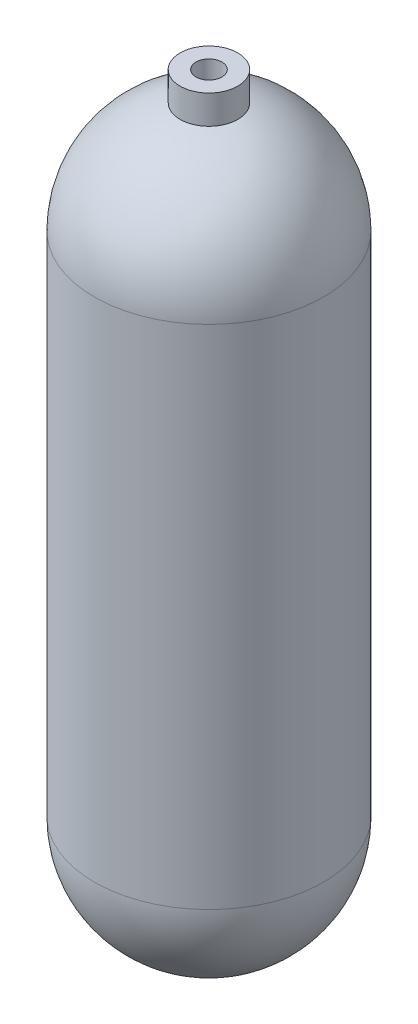
ISO-10303-21;
HEADER;
FILE_DESCRIPTION(('STEP AP214'),'2;1');
FILE_NAME('part.step','',(''),(''),'','','');
FILE_SCHEMA(('AUTOMOTIVE_DESIGN { 1 0 10303 214 1 1 1 1 }'));
ENDSEC;
DATA;
#1=APPLICATION_CONTEXT('core data for automotive mechanical design processes');
#2=APPLICATION_PROTOCOL_DEFINITION('international standard','automotive_design',2000,#1);
#3=PRODUCT_CONTEXT('',#1,'mechanical');
#4=PRODUCT('Part','Part','',(#3));
#5=PRODUCT_RELATED_PRODUCT_CATEGORY('part','',(#4));
#6=PRODUCT_DEFINITION_FORMATION('','',#4);
#7=PRODUCT_DEFINITION_CONTEXT('part definition',#1,'design');
#8=PRODUCT_DEFINITION('design','',#6,#7);
#9=PRODUCT_DEFINITION_SHAPE('','',#8);
#10=(LENGTH_UNIT() NAMED_UNIT(*) SI_UNIT(.MILLI.,.METRE.));
#11=(NAMED_UNIT(*) PLANE_ANGLE_UNIT() SI_UNIT($,.RADIAN.));
#12=(NAMED_UNIT(*) SI_UNIT($,.STERADIAN.) SOLID_ANGLE_UNIT());
#13=UNCERTAINTY_MEASURE_WITH_UNIT(LENGTH_MEASURE(1.E-05),#10,'distance_accuracy_value','');
#14=(GEOMETRIC_REPRESENTATION_CONTEXT(3) GLOBAL_UNCERTAINTY_ASSIGNED_CONTEXT((#13)) GLOBAL_UNIT_ASSIGNED_CONTEXT((#10,
#11,#12)) REPRESENTATION_CONTEXT('',''));
#15=CARTESIAN_POINT('',(0.,0.,0.));
#16=DIRECTION('',(0.,0.,1.));
#17=DIRECTION('',(1.,0.,0.));
#18=AXIS2_PLACEMENT_3D('',#15,#16,#17);
#19=CARTESIAN_POINT('',(-0.00565630739373267,-448.500000201219,0.));
#20=DIRECTION('',(0.,0.,-1.));
#21=DIRECTION('',(-1.,0.,0.));
#22=AXIS2_PLACEMENT_3D('',#19,#20,#21);
#23=CIRCLE('',#22,79.5);
#24=TRIMMED_CURVE('',#23,(PARAMETER_VALUE(-1.57086747531563)),
(PARAMETER_VALUE(1.57086747531563)),.T.,.PARAMETER.);
#25=CARTESIAN_POINT('',(0.,-448.500000201219,0.));
#26=DIRECTION('',(0.,1.,0.));
#27=AXIS1_PLACEMENT('',#25,#26);
#28=SURFACE_OF_REVOLUTION('',#24,#27);
#29=CARTESIAN_POINT('',(0.,-528.,0.));
#30=VERTEX_POINT('',#29);
#31=VERTEX_LOOP('',#30);
#32=FACE_BOUND('',#31,.T.);
#33=CARTESIAN_POINT('',(0.,-448.500000201219,0.));
#34=DIRECTION('',(0.,1.,0.));
#35=DIRECTION('',(-1.,0.,0.));
#36=AXIS2_PLACEMENT_3D('',#33,#34,#35);
#37=CIRCLE('',#36,79.5056563073938);
#38=CARTESIAN_POINT('',(-79.5056563073937,-448.500000201219,0.));
#39=VERTEX_POINT('',#38);
#40=EDGE_CURVE('E55',#39,#39,#37,.T.);
#41=ORIENTED_EDGE('',*,*,#40,.F.);
#42=EDGE_LOOP('',(#41));
#43=FACE_BOUND('',#42,.T.);
#44=ADVANCED_FACE('F41',(#32,#43),#28,.T.);
#45=CARTESIAN_POINT('',(-9.,-20.,0.));
#46=DIRECTION('',(0.,1.,0.));
#47=DIRECTION('',(-1.,0.,0.));
#48=AXIS2_PLACEMENT_3D('',#45,#46,#47);
#49=PLANE('',#48);
#50=CARTESIAN_POINT('',(0.,-20.,0.));
#51=DIRECTION('',(0.,1.,0.));
#52=DIRECTION('',(-1.,0.,0.));
#53=AXIS2_PLACEMENT_3D('',#50,#51,#52);
#54=CIRCLE('',#53,9.);
#55=CARTESIAN_POINT('',(-9.,-20.,0.));
#56=VERTEX_POINT('',#55);
#57=EDGE_CURVE('E11',#56,#56,#54,.T.);
#58=ORIENTED_EDGE('',*,*,#57,.T.);
#59=EDGE_LOOP('',(#58));
#60=FACE_BOUND('',#59,.T.);
#61=ADVANCED_FACE('F52',(#60),#49,.T.);
#62=CARTESIAN_POINT('',(0.,0.,0.));
#63=DIRECTION('',(0.,1.,0.));
#64=DIRECTION('',(-1.,0.,0.));
#65=AXIS2_PLACEMENT_3D('',#62,#63,#64);
#66=CYLINDRICAL_SURFACE('',#65,9.);
#67=CARTESIAN_POINT('',(0.,0.,0.));
#68=DIRECTION('',(0.,1.,0.));
#69=DIRECTION('',(-1.,0.,0.));
#70=AXIS2_PLACEMENT_3D('',#67,#68,#69);
#71=CIRCLE('',#70,9.);
#72=CARTESIAN_POINT('',(-9.,0.,0.));
#73=VERTEX_POINT('',#72);
#74=EDGE_CURVE('E47',#73,#73,#71,.T.);
#75=ORIENTED_EDGE('',*,*,#74,.T.);
#76=EDGE_LOOP('',(#75));
#77=FACE_BOUND('',#76,.T.);
#78=ORIENTED_EDGE('',*,*,#57,.F.);
#79=EDGE_LOOP('',(#78));
#80=FACE_BOUND('',#79,.T.);
#81=ADVANCED_FACE('F70',(#77,#80),#66,.F.);
#82=CARTESIAN_POINT('',(-20.,0.,0.));
#83=DIRECTION('',(0.,1.,0.));
#84=DIRECTION('',(-1.,0.,0.));
#85=AXIS2_PLACEMENT_3D('',#82,#83,#84);
#86=PLANE('',#85);
#87=CARTESIAN_POINT('',(0.,0.,0.));
#88=DIRECTION('',(0.,1.,0.));
#89=DIRECTION('',(-1.,0.,0.));
#90=AXIS2_PLACEMENT_3D('',#87,#88,#89);
#91=CIRCLE('',#90,20.);
#92=CARTESIAN_POINT('',(-20.,0.,0.));
#93=VERTEX_POINT('',#92);
#94=EDGE_CURVE('E65',#93,#93,#91,.T.);
#95=ORIENTED_EDGE('',*,*,#94,.T.);
#96=EDGE_LOOP('',(#95));
#97=FACE_BOUND('',#96,.T.);
#98=ORIENTED_EDGE('',*,*,#74,.F.);
#99=EDGE_LOOP('',(#98));
#100=FACE_BOUND('',#99,.T.);
#101=ADVANCED_FACE('F73',(#97,#100),#86,.T.);
#102=CARTESIAN_POINT('',(0.,0.,0.));
#103=DIRECTION('',(0.,1.,0.));
#104=DIRECTION('',(-1.,0.,0.));
#105=AXIS2_PLACEMENT_3D('',#102,#103,#104);
#106=CYLINDRICAL_SURFACE('',#105,20.);
#107=CARTESIAN_POINT('',(0.,-20.,0.));
#108=DIRECTION('',(0.,1.,0.));
#109=DIRECTION('',(-1.,0.,0.));
#110=AXIS2_PLACEMENT_3D('',#107,#108,#109);
#111=CIRCLE('',#110,20.);
#112=CARTESIAN_POINT('',(-20.,-20.,0.));
#113=VERTEX_POINT('',#112);
#114=EDGE_CURVE('E60',#113,#113,#111,.T.);
#115=ORIENTED_EDGE('',*,*,#114,.T.);
#116=EDGE_LOOP('',(#115));
#117=FACE_BOUND('',#116,.T.);
#118=ORIENTED_EDGE('',*,*,#94,.F.);
#119=EDGE_LOOP('',(#118));
#120=FACE_BOUND('',#119,.T.);
#121=ADVANCED_FACE('F75',(#117,#120),#106,.T.);
#122=CARTESIAN_POINT('',(0.,-96.9446308737779,0.));
#123=DIRECTION('',(0.,1.,0.));
#124=DIRECTION('',(-1.,0.,0.));
#125=AXIS2_PLACEMENT_3D('',#122,#123,#124);
#126=DEGENERATE_TOROIDAL_SURFACE('',#125,0.0056563073937644,79.5,.T.);
#127=CARTESIAN_POINT('',(0.,-96.9446308737779,0.));
#128=DIRECTION('',(0.,1.,0.));
#129=DIRECTION('',(-1.,0.,0.));
#130=AXIS2_PLACEMENT_3D('',#127,#128,#129);
#131=CIRCLE('',#130,79.5056563073938);
#132=CARTESIAN_POINT('',(-79.5056563073937,-96.9446308737779,0.));
#133=VERTEX_POINT('',#132);
#134=EDGE_CURVE('E57',#133,#133,#131,.T.);
#135=ORIENTED_EDGE('',*,*,#134,.T.);
#136=EDGE_LOOP('',(#135));
#137=FACE_BOUND('',#136,.T.);
#138=ORIENTED_EDGE('',*,*,#114,.F.);
#139=EDGE_LOOP('',(#138));
#140=FACE_BOUND('',#139,.T.);
#141=ADVANCED_FACE('F82',(#137,#140),#126,.T.);
#142=CARTESIAN_POINT('',(0.,0.,0.));
#143=DIRECTION('',(0.,1.,0.));
#144=DIRECTION('',(-1.,0.,0.));
#145=AXIS2_PLACEMENT_3D('',#142,#143,#144);
#146=CYLINDRICAL_SURFACE('',#145,79.5056563073938);
#147=ORIENTED_EDGE('',*,*,#40,.T.);
#148=EDGE_LOOP('',(#147));
#149=FACE_BOUND('',#148,.T.);
#150=ORIENTED_EDGE('',*,*,#134,.F.);
#151=EDGE_LOOP('',(#150));
#152=FACE_BOUND('',#151,.T.);
#153=ADVANCED_FACE('F119',(#149,#152),#146,.T.);
#154=CLOSED_SHELL('',(#44,#61,#81,#101,#121,#141,#153));
#155=MANIFOLD_SOLID_BREP('B2',#154);
#156=ADVANCED_BREP_SHAPE_REPRESENTATION('',(#18,#155),#14);
#157=SHAPE_DEFINITION_REPRESENTATION(#9,#156);
ENDSEC;
END-ISO-10303-21;
